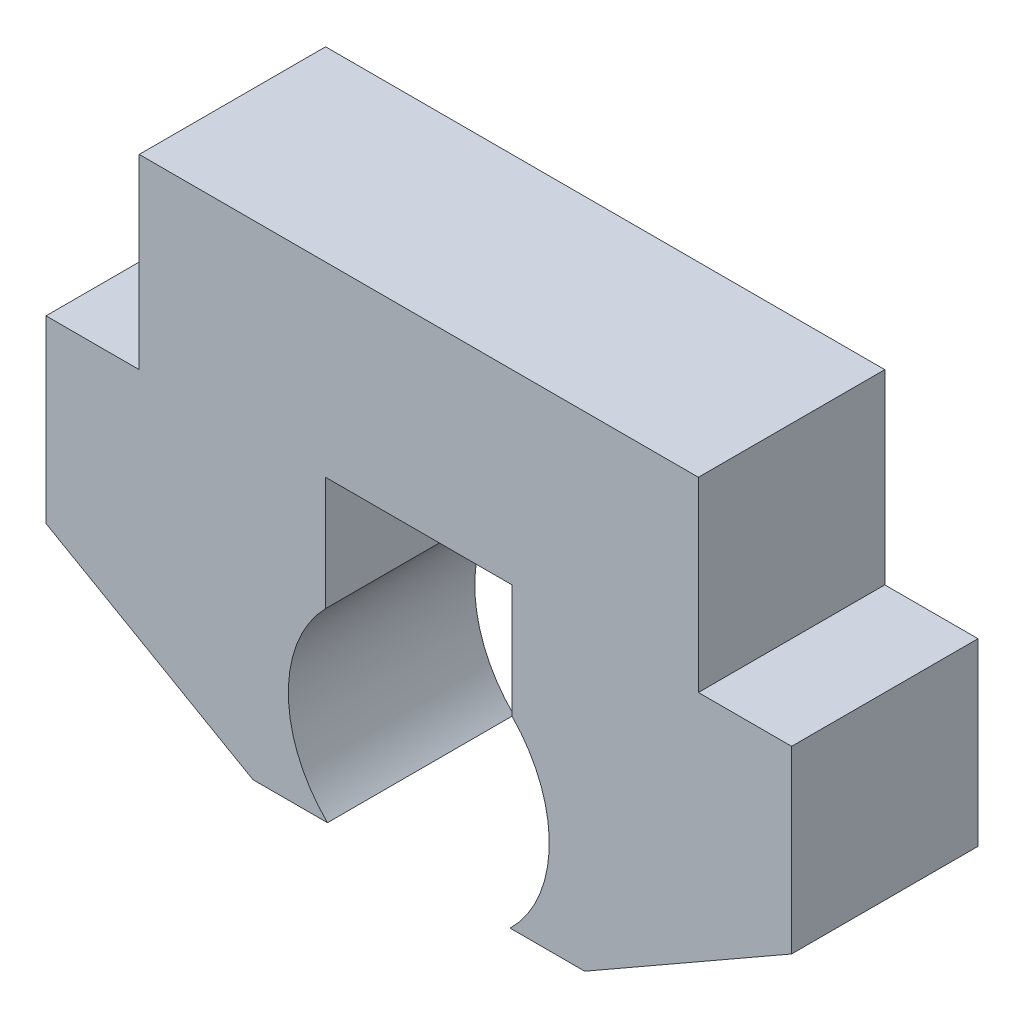
ISO-10303-21;
HEADER;
FILE_DESCRIPTION(('STEP AP214'),'2;1');
FILE_NAME('part.step','',(''),(''),'','','');
FILE_SCHEMA(('AUTOMOTIVE_DESIGN { 1 0 10303 214 1 1 1 1 }'));
ENDSEC;
DATA;
#1=APPLICATION_CONTEXT('core data for automotive mechanical design processes');
#2=APPLICATION_PROTOCOL_DEFINITION('international standard','automotive_design',2000,#1);
#3=PRODUCT_CONTEXT('',#1,'mechanical');
#4=PRODUCT('Part','Part','',(#3));
#5=PRODUCT_RELATED_PRODUCT_CATEGORY('part','',(#4));
#6=PRODUCT_DEFINITION_FORMATION('','',#4);
#7=PRODUCT_DEFINITION_CONTEXT('part definition',#1,'design');
#8=PRODUCT_DEFINITION('design','',#6,#7);
#9=PRODUCT_DEFINITION_SHAPE('','',#8);
#10=(LENGTH_UNIT() NAMED_UNIT(*) SI_UNIT(.MILLI.,.METRE.));
#11=(NAMED_UNIT(*) PLANE_ANGLE_UNIT() SI_UNIT($,.RADIAN.));
#12=(NAMED_UNIT(*) SI_UNIT($,.STERADIAN.) SOLID_ANGLE_UNIT());
#13=UNCERTAINTY_MEASURE_WITH_UNIT(LENGTH_MEASURE(1.E-05),#10,'distance_accuracy_value','');
#14=(GEOMETRIC_REPRESENTATION_CONTEXT(3) GLOBAL_UNCERTAINTY_ASSIGNED_CONTEXT((#13)) GLOBAL_UNIT_ASSIGNED_CONTEXT((#10,
#11,#12)) REPRESENTATION_CONTEXT('',''));
#15=CARTESIAN_POINT('',(0.,0.,0.));
#16=DIRECTION('',(0.,0.,1.));
#17=DIRECTION('',(1.,0.,0.));
#18=AXIS2_PLACEMENT_3D('',#15,#16,#17);
#19=CARTESIAN_POINT('',(12.5,8.82463386228836,5.));
#20=DIRECTION('',(1.,0.,0.));
#21=DIRECTION('',(0.,0.,-1.));
#22=AXIS2_PLACEMENT_3D('',#19,#20,#21);
#23=PLANE('',#22);
#24=DIRECTION('',(0.,-1.,0.));
#25=VECTOR('',#24,1.);
#26=CARTESIAN_POINT('',(12.5,8.82463386228836,0.));
#27=LINE('',#26,#25);
#28=CARTESIAN_POINT('',(12.5,8.82463386228836,0.));
#29=VERTEX_POINT('',#28);
#30=CARTESIAN_POINT('',(12.5,5.77412360507153,0.));
#31=VERTEX_POINT('',#30);
#32=EDGE_CURVE('E303',#29,#31,#27,.T.);
#33=ORIENTED_EDGE('',*,*,#32,.T.);
#34=DIRECTION('',(0.,0.,-1.));
#35=VECTOR('',#34,1.);
#36=CARTESIAN_POINT('',(12.5,5.77412360507153,5.));
#37=LINE('',#36,#35);
#38=CARTESIAN_POINT('',(12.5,5.77412360507153,5.));
#39=VERTEX_POINT('',#38);
#40=EDGE_CURVE('E12',#39,#31,#37,.T.);
#41=ORIENTED_EDGE('',*,*,#40,.F.);
#42=DIRECTION('',(0.,-1.,0.));
#43=VECTOR('',#42,1.);
#44=CARTESIAN_POINT('',(12.5,8.82463386228836,5.));
#45=LINE('',#44,#43);
#46=CARTESIAN_POINT('',(12.5,8.82463386228836,5.));
#47=VERTEX_POINT('',#46);
#48=EDGE_CURVE('E244',#47,#39,#45,.T.);
#49=ORIENTED_EDGE('',*,*,#48,.F.);
#50=DIRECTION('',(0.,0.,-1.));
#51=VECTOR('',#50,1.);
#52=CARTESIAN_POINT('',(12.5,8.82463386228836,5.));
#53=LINE('',#52,#51);
#54=EDGE_CURVE('E181',#47,#29,#53,.T.);
#55=ORIENTED_EDGE('',*,*,#54,.T.);
#56=EDGE_LOOP('',(#33,#41,#49,#55));
#57=FACE_BOUND('',#56,.T.);
#58=ADVANCED_FACE('F38',(#57),#23,.F.);
#59=CARTESIAN_POINT('',(10.,3.32463386228836,5.));
#60=DIRECTION('',(0.,0.,-1.));
#61=DIRECTION('',(-1.,0.,0.));
#62=AXIS2_PLACEMENT_3D('',#59,#60,#61);
#63=CYLINDRICAL_SURFACE('',#62,3.5);
#64=CARTESIAN_POINT('',(10.,3.32463386228836,0.));
#65=DIRECTION('',(0.,0.,-1.));
#66=DIRECTION('',(1.,0.,0.));
#67=AXIS2_PLACEMENT_3D('',#64,#65,#66);
#68=CIRCLE('',#67,3.5);
#69=CARTESIAN_POINT('',(12.4494897427832,0.824633862288362,0.));
#70=VERTEX_POINT('',#69);
#71=EDGE_CURVE('E297',#31,#70,#68,.T.);
#72=ORIENTED_EDGE('',*,*,#71,.T.);
#73=DIRECTION('',(0.,0.,-1.));
#74=VECTOR('',#73,1.);
#75=CARTESIAN_POINT('',(12.4494897427832,0.824633862288362,5.));
#76=LINE('',#75,#74);
#77=CARTESIAN_POINT('',(12.4494897427832,0.824633862288362,5.));
#78=VERTEX_POINT('',#77);
#79=EDGE_CURVE('E46',#78,#70,#76,.T.);
#80=ORIENTED_EDGE('',*,*,#79,.F.);
#81=CARTESIAN_POINT('',(10.,3.32463386228836,5.));
#82=DIRECTION('',(0.,0.,-1.));
#83=DIRECTION('',(1.,0.,0.));
#84=AXIS2_PLACEMENT_3D('',#81,#82,#83);
#85=CIRCLE('',#84,3.5);
#86=EDGE_CURVE('E121',#39,#78,#85,.T.);
#87=ORIENTED_EDGE('',*,*,#86,.F.);
#88=ORIENTED_EDGE('',*,*,#40,.T.);
#89=EDGE_LOOP('',(#72,#80,#87,#88));
#90=FACE_BOUND('',#89,.T.);
#91=ADVANCED_FACE('F341',(#90),#63,.F.);
#92=CARTESIAN_POINT('',(12.4494897427832,0.824633862288362,5.));
#93=DIRECTION('',(0.,1.,0.));
#94=DIRECTION('',(0.,0.,1.));
#95=AXIS2_PLACEMENT_3D('',#92,#93,#94);
#96=PLANE('',#95);
#97=DIRECTION('',(1.,0.,0.));
#98=VECTOR('',#97,1.);
#99=CARTESIAN_POINT('',(12.4494897427832,0.824633862288362,0.));
#100=LINE('',#99,#98);
#101=CARTESIAN_POINT('',(14.4494897427832,0.824633862288362,0.));
#102=VERTEX_POINT('',#101);
#103=EDGE_CURVE('E292',#70,#102,#100,.T.);
#104=ORIENTED_EDGE('',*,*,#103,.T.);
#105=DIRECTION('',(0.,0.,-1.));
#106=VECTOR('',#105,1.);
#107=CARTESIAN_POINT('',(14.4494897427832,0.824633862288362,5.));
#108=LINE('',#107,#106);
#109=CARTESIAN_POINT('',(14.4494897427832,0.824633862288362,5.));
#110=VERTEX_POINT('',#109);
#111=EDGE_CURVE('E284',#110,#102,#108,.T.);
#112=ORIENTED_EDGE('',*,*,#111,.F.);
#113=DIRECTION('',(1.,0.,0.));
#114=VECTOR('',#113,1.);
#115=CARTESIAN_POINT('',(12.4494897427832,0.824633862288362,5.));
#116=LINE('',#115,#114);
#117=EDGE_CURVE('E236',#78,#110,#116,.T.);
#118=ORIENTED_EDGE('',*,*,#117,.F.);
#119=ORIENTED_EDGE('',*,*,#79,.T.);
#120=EDGE_LOOP('',(#104,#112,#118,#119));
#121=FACE_BOUND('',#120,.T.);
#122=ADVANCED_FACE('F290',(#121),#96,.F.);
#123=CARTESIAN_POINT('',(20.,4.,5.));
#124=DIRECTION('',(-0.496568694783565,0.867997425895346,0.));
#125=DIRECTION('',(-0.867997425895346,-0.496568694783565,0.));
#126=AXIS2_PLACEMENT_3D('',#123,#124,#125);
#127=PLANE('',#126);
#128=DIRECTION('',(0.867997425895346,0.496568694783565,0.));
#129=VECTOR('',#128,1.);
#130=CARTESIAN_POINT('',(20.,4.,0.));
#131=LINE('',#130,#129);
#132=CARTESIAN_POINT('',(20.,4.,0.));
#133=VERTEX_POINT('',#132);
#134=EDGE_CURVE('E299',#102,#133,#131,.T.);
#135=ORIENTED_EDGE('',*,*,#134,.T.);
#136=DIRECTION('',(0.,0.,-1.));
#137=VECTOR('',#136,1.);
#138=CARTESIAN_POINT('',(20.,4.,5.));
#139=LINE('',#138,#137);
#140=CARTESIAN_POINT('',(20.,4.,5.));
#141=VERTEX_POINT('',#140);
#142=EDGE_CURVE('E281',#141,#133,#139,.T.);
#143=ORIENTED_EDGE('',*,*,#142,.F.);
#144=DIRECTION('',(0.867997425895346,0.496568694783565,0.));
#145=VECTOR('',#144,1.);
#146=CARTESIAN_POINT('',(20.,4.,5.));
#147=LINE('',#146,#145);
#148=EDGE_CURVE('E232',#110,#141,#147,.T.);
#149=ORIENTED_EDGE('',*,*,#148,.F.);
#150=ORIENTED_EDGE('',*,*,#111,.T.);
#151=EDGE_LOOP('',(#135,#143,#149,#150));
#152=FACE_BOUND('',#151,.T.);
#153=ADVANCED_FACE('F348',(#152),#127,.F.);
#154=CARTESIAN_POINT('',(20.,4.,5.));
#155=DIRECTION('',(-1.,0.,0.));
#156=DIRECTION('',(0.,0.,1.));
#157=AXIS2_PLACEMENT_3D('',#154,#155,#156);
#158=PLANE('',#157);
#159=DIRECTION('',(0.,1.,0.));
#160=VECTOR('',#159,1.);
#161=CARTESIAN_POINT('',(20.,4.,0.));
#162=LINE('',#161,#160);
#163=CARTESIAN_POINT('',(20.,8.82463386228836,0.));
#164=VERTEX_POINT('',#163);
#165=EDGE_CURVE('E301',#133,#164,#162,.T.);
#166=ORIENTED_EDGE('',*,*,#165,.T.);
#167=DIRECTION('',(0.,0.,-1.));
#168=VECTOR('',#167,1.);
#169=CARTESIAN_POINT('',(20.,8.82463386228836,5.));
#170=LINE('',#169,#168);
#171=CARTESIAN_POINT('',(20.,8.82463386228836,5.));
#172=VERTEX_POINT('',#171);
#173=EDGE_CURVE('E278',#172,#164,#170,.T.);
#174=ORIENTED_EDGE('',*,*,#173,.F.);
#175=DIRECTION('',(0.,1.,0.));
#176=VECTOR('',#175,1.);
#177=CARTESIAN_POINT('',(20.,4.,5.));
#178=LINE('',#177,#176);
#179=EDGE_CURVE('E229',#141,#172,#178,.T.);
#180=ORIENTED_EDGE('',*,*,#179,.F.);
#181=ORIENTED_EDGE('',*,*,#142,.T.);
#182=EDGE_LOOP('',(#166,#174,#180,#181));
#183=FACE_BOUND('',#182,.T.);
#184=ADVANCED_FACE('F353',(#183),#158,.F.);
#185=CARTESIAN_POINT('',(17.5,8.82463386228836,5.));
#186=DIRECTION('',(0.,-1.,0.));
#187=DIRECTION('',(0.,0.,-1.));
#188=AXIS2_PLACEMENT_3D('',#185,#186,#187);
#189=PLANE('',#188);
#190=DIRECTION('',(-1.,0.,0.));
#191=VECTOR('',#190,1.);
#192=CARTESIAN_POINT('',(17.5,8.82463386228836,0.));
#193=LINE('',#192,#191);
#194=CARTESIAN_POINT('',(17.5,8.82463386228836,0.));
#195=VERTEX_POINT('',#194);
#196=EDGE_CURVE('E307',#164,#195,#193,.T.);
#197=ORIENTED_EDGE('',*,*,#196,.T.);
#198=DIRECTION('',(0.,0.,-1.));
#199=VECTOR('',#198,1.);
#200=CARTESIAN_POINT('',(17.5,8.82463386228836,5.));
#201=LINE('',#200,#199);
#202=CARTESIAN_POINT('',(17.5,8.82463386228836,5.));
#203=VERTEX_POINT('',#202);
#204=EDGE_CURVE('E275',#203,#195,#201,.T.);
#205=ORIENTED_EDGE('',*,*,#204,.F.);
#206=DIRECTION('',(-1.,0.,0.));
#207=VECTOR('',#206,1.);
#208=CARTESIAN_POINT('',(17.5,8.82463386228836,5.));
#209=LINE('',#208,#207);
#210=EDGE_CURVE('E221',#172,#203,#209,.T.);
#211=ORIENTED_EDGE('',*,*,#210,.F.);
#212=ORIENTED_EDGE('',*,*,#173,.T.);
#213=EDGE_LOOP('',(#197,#205,#211,#212));
#214=FACE_BOUND('',#213,.T.);
#215=ADVANCED_FACE('F357',(#214),#189,.F.);
#216=CARTESIAN_POINT('',(17.5,8.82463386228836,5.));
#217=DIRECTION('',(-1.,0.,0.));
#218=DIRECTION('',(0.,0.,1.));
#219=AXIS2_PLACEMENT_3D('',#216,#217,#218);
#220=PLANE('',#219);
#221=DIRECTION('',(0.,1.,0.));
#222=VECTOR('',#221,1.);
#223=CARTESIAN_POINT('',(17.5,8.82463386228836,0.));
#224=LINE('',#223,#222);
#225=CARTESIAN_POINT('',(17.5,13.8246338622884,0.));
#226=VERTEX_POINT('',#225);
#227=EDGE_CURVE('E309',#195,#226,#224,.T.);
#228=ORIENTED_EDGE('',*,*,#227,.T.);
#229=DIRECTION('',(0.,0.,-1.));
#230=VECTOR('',#229,1.);
#231=CARTESIAN_POINT('',(17.5,13.8246338622884,5.));
#232=LINE('',#231,#230);
#233=CARTESIAN_POINT('',(17.5,13.8246338622884,5.));
#234=VERTEX_POINT('',#233);
#235=EDGE_CURVE('E272',#234,#226,#232,.T.);
#236=ORIENTED_EDGE('',*,*,#235,.F.);
#237=DIRECTION('',(0.,1.,0.));
#238=VECTOR('',#237,1.);
#239=CARTESIAN_POINT('',(17.5,8.82463386228836,5.));
#240=LINE('',#239,#238);
#241=EDGE_CURVE('E217',#203,#234,#240,.T.);
#242=ORIENTED_EDGE('',*,*,#241,.F.);
#243=ORIENTED_EDGE('',*,*,#204,.T.);
#244=EDGE_LOOP('',(#228,#236,#242,#243));
#245=FACE_BOUND('',#244,.T.);
#246=ADVANCED_FACE('F361',(#245),#220,.F.);
#247=CARTESIAN_POINT('',(2.5,13.8246338622884,5.));
#248=DIRECTION('',(0.,-1.,0.));
#249=DIRECTION('',(0.,0.,-1.));
#250=AXIS2_PLACEMENT_3D('',#247,#248,#249);
#251=PLANE('',#250);
#252=DIRECTION('',(-1.,0.,0.));
#253=VECTOR('',#252,1.);
#254=CARTESIAN_POINT('',(2.5,13.8246338622884,0.));
#255=LINE('',#254,#253);
#256=CARTESIAN_POINT('',(2.5,13.8246338622884,0.));
#257=VERTEX_POINT('',#256);
#258=EDGE_CURVE('E312',#226,#257,#255,.T.);
#259=ORIENTED_EDGE('',*,*,#258,.T.);
#260=DIRECTION('',(0.,0.,-1.));
#261=VECTOR('',#260,1.);
#262=CARTESIAN_POINT('',(2.5,13.8246338622884,5.));
#263=LINE('',#262,#261);
#264=CARTESIAN_POINT('',(2.5,13.8246338622884,5.));
#265=VERTEX_POINT('',#264);
#266=EDGE_CURVE('E269',#265,#257,#263,.T.);
#267=ORIENTED_EDGE('',*,*,#266,.F.);
#268=DIRECTION('',(-1.,0.,0.));
#269=VECTOR('',#268,1.);
#270=CARTESIAN_POINT('',(10.,13.8246338622884,5.));
#271=LINE('',#270,#269);
#272=EDGE_CURVE('E213',#234,#265,#271,.T.);
#273=ORIENTED_EDGE('',*,*,#272,.F.);
#274=ORIENTED_EDGE('',*,*,#235,.T.);
#275=EDGE_LOOP('',(#259,#267,#273,#274));
#276=FACE_BOUND('',#275,.T.);
#277=ADVANCED_FACE('F365',(#276),#251,.F.);
#278=CARTESIAN_POINT('',(2.5,8.82463386228836,5.));
#279=DIRECTION('',(1.,0.,0.));
#280=DIRECTION('',(0.,0.,-1.));
#281=AXIS2_PLACEMENT_3D('',#278,#279,#280);
#282=PLANE('',#281);
#283=DIRECTION('',(0.,-1.,0.));
#284=VECTOR('',#283,1.);
#285=CARTESIAN_POINT('',(2.5,8.82463386228836,0.));
#286=LINE('',#285,#284);
#287=CARTESIAN_POINT('',(2.5,8.82463386228836,0.));
#288=VERTEX_POINT('',#287);
#289=EDGE_CURVE('E314',#257,#288,#286,.T.);
#290=ORIENTED_EDGE('',*,*,#289,.T.);
#291=DIRECTION('',(0.,0.,-1.));
#292=VECTOR('',#291,1.);
#293=CARTESIAN_POINT('',(2.5,8.82463386228836,5.));
#294=LINE('',#293,#292);
#295=CARTESIAN_POINT('',(2.5,8.82463386228836,5.));
#296=VERTEX_POINT('',#295);
#297=EDGE_CURVE('E266',#296,#288,#294,.T.);
#298=ORIENTED_EDGE('',*,*,#297,.F.);
#299=DIRECTION('',(0.,-1.,0.));
#300=VECTOR('',#299,1.);
#301=CARTESIAN_POINT('',(2.5,8.82463386228836,5.));
#302=LINE('',#301,#300);
#303=EDGE_CURVE('E210',#265,#296,#302,.T.);
#304=ORIENTED_EDGE('',*,*,#303,.F.);
#305=ORIENTED_EDGE('',*,*,#266,.T.);
#306=EDGE_LOOP('',(#290,#298,#304,#305));
#307=FACE_BOUND('',#306,.T.);
#308=ADVANCED_FACE('F369',(#307),#282,.F.);
#309=CARTESIAN_POINT('',(2.5,8.82463386228836,5.));
#310=DIRECTION('',(0.,-1.,0.));
#311=DIRECTION('',(0.,0.,-1.));
#312=AXIS2_PLACEMENT_3D('',#309,#310,#311);
#313=PLANE('',#312);
#314=DIRECTION('',(-1.,0.,0.));
#315=VECTOR('',#314,1.);
#316=CARTESIAN_POINT('',(2.5,8.82463386228836,0.));
#317=LINE('',#316,#315);
#318=CARTESIAN_POINT('',(0.,8.82463386228836,0.));
#319=VERTEX_POINT('',#318);
#320=EDGE_CURVE('E316',#288,#319,#317,.T.);
#321=ORIENTED_EDGE('',*,*,#320,.T.);
#322=DIRECTION('',(0.,0.,-1.));
#323=VECTOR('',#322,1.);
#324=CARTESIAN_POINT('',(0.,8.82463386228836,5.));
#325=LINE('',#324,#323);
#326=CARTESIAN_POINT('',(0.,8.82463386228836,5.));
#327=VERTEX_POINT('',#326);
#328=EDGE_CURVE('E263',#327,#319,#325,.T.);
#329=ORIENTED_EDGE('',*,*,#328,.F.);
#330=DIRECTION('',(-1.,0.,0.));
#331=VECTOR('',#330,1.);
#332=CARTESIAN_POINT('',(2.5,8.82463386228836,5.));
#333=LINE('',#332,#331);
#334=EDGE_CURVE('E202',#296,#327,#333,.T.);
#335=ORIENTED_EDGE('',*,*,#334,.F.);
#336=ORIENTED_EDGE('',*,*,#297,.T.);
#337=EDGE_LOOP('',(#321,#329,#335,#336));
#338=FACE_BOUND('',#337,.T.);
#339=ADVANCED_FACE('F373',(#338),#313,.F.);
#340=CARTESIAN_POINT('',(0.,4.,5.));
#341=DIRECTION('',(1.,0.,0.));
#342=DIRECTION('',(0.,0.,-1.));
#343=AXIS2_PLACEMENT_3D('',#340,#341,#342);
#344=PLANE('',#343);
#345=DIRECTION('',(0.,-1.,0.));
#346=VECTOR('',#345,1.);
#347=CARTESIAN_POINT('',(0.,4.,0.));
#348=LINE('',#347,#346);
#349=CARTESIAN_POINT('',(0.,4.,0.));
#350=VERTEX_POINT('',#349);
#351=EDGE_CURVE('E318',#319,#350,#348,.T.);
#352=ORIENTED_EDGE('',*,*,#351,.T.);
#353=DIRECTION('',(0.,0.,-1.));
#354=VECTOR('',#353,1.);
#355=CARTESIAN_POINT('',(0.,4.,5.));
#356=LINE('',#355,#354);
#357=CARTESIAN_POINT('',(0.,4.,5.));
#358=VERTEX_POINT('',#357);
#359=EDGE_CURVE('E260',#358,#350,#356,.T.);
#360=ORIENTED_EDGE('',*,*,#359,.F.);
#361=DIRECTION('',(0.,-1.,0.));
#362=VECTOR('',#361,1.);
#363=CARTESIAN_POINT('',(0.,4.,5.));
#364=LINE('',#363,#362);
#365=EDGE_CURVE('E198',#327,#358,#364,.T.);
#366=ORIENTED_EDGE('',*,*,#365,.F.);
#367=ORIENTED_EDGE('',*,*,#328,.T.);
#368=EDGE_LOOP('',(#352,#360,#366,#367));
#369=FACE_BOUND('',#368,.T.);
#370=ADVANCED_FACE('F377',(#369),#344,.F.);
#371=CARTESIAN_POINT('',(0.,4.,5.));
#372=DIRECTION('',(0.496568694783565,0.867997425895346,0.));
#373=DIRECTION('',(-0.867997425895346,0.496568694783565,0.));
#374=AXIS2_PLACEMENT_3D('',#371,#372,#373);
#375=PLANE('',#374);
#376=DIRECTION('',(0.867997425895346,-0.496568694783565,0.));
#377=VECTOR('',#376,1.);
#378=CARTESIAN_POINT('',(0.,4.,0.));
#379=LINE('',#378,#377);
#380=CARTESIAN_POINT('',(5.55051025721682,0.824633862288362,0.));
#381=VERTEX_POINT('',#380);
#382=EDGE_CURVE('E320',#350,#381,#379,.T.);
#383=ORIENTED_EDGE('',*,*,#382,.T.);
#384=DIRECTION('',(0.,0.,-1.));
#385=VECTOR('',#384,1.);
#386=CARTESIAN_POINT('',(5.55051025721682,0.824633862288362,5.));
#387=LINE('',#386,#385);
#388=CARTESIAN_POINT('',(5.55051025721682,0.824633862288362,5.));
#389=VERTEX_POINT('',#388);
#390=EDGE_CURVE('E257',#389,#381,#387,.T.);
#391=ORIENTED_EDGE('',*,*,#390,.F.);
#392=DIRECTION('',(0.867997425895346,-0.496568694783565,0.));
#393=VECTOR('',#392,1.);
#394=CARTESIAN_POINT('',(0.,4.,5.));
#395=LINE('',#394,#393);
#396=EDGE_CURVE('E194',#358,#389,#395,.T.);
#397=ORIENTED_EDGE('',*,*,#396,.F.);
#398=ORIENTED_EDGE('',*,*,#359,.T.);
#399=EDGE_LOOP('',(#383,#391,#397,#398));
#400=FACE_BOUND('',#399,.T.);
#401=ADVANCED_FACE('F381',(#400),#375,.F.);
#402=CARTESIAN_POINT('',(5.55051025721682,0.824633862288362,5.));
#403=DIRECTION('',(0.,1.,0.));
#404=DIRECTION('',(0.,0.,1.));
#405=AXIS2_PLACEMENT_3D('',#402,#403,#404);
#406=PLANE('',#405);
#407=DIRECTION('',(1.,0.,0.));
#408=VECTOR('',#407,1.);
#409=CARTESIAN_POINT('',(5.55051025721682,0.824633862288362,0.));
#410=LINE('',#409,#408);
#411=CARTESIAN_POINT('',(7.55051025721682,0.824633862288362,0.));
#412=VERTEX_POINT('',#411);
#413=EDGE_CURVE('E322',#381,#412,#410,.T.);
#414=ORIENTED_EDGE('',*,*,#413,.T.);
#415=DIRECTION('',(0.,0.,-1.));
#416=VECTOR('',#415,1.);
#417=CARTESIAN_POINT('',(7.55051025721682,0.824633862288362,5.));
#418=LINE('',#417,#416);
#419=CARTESIAN_POINT('',(7.55051025721682,0.824633862288362,5.));
#420=VERTEX_POINT('',#419);
#421=EDGE_CURVE('E174',#420,#412,#418,.T.);
#422=ORIENTED_EDGE('',*,*,#421,.F.);
#423=DIRECTION('',(1.,0.,0.));
#424=VECTOR('',#423,1.);
#425=CARTESIAN_POINT('',(5.55051025721682,0.824633862288362,5.));
#426=LINE('',#425,#424);
#427=EDGE_CURVE('E164',#389,#420,#426,.T.);
#428=ORIENTED_EDGE('',*,*,#427,.F.);
#429=ORIENTED_EDGE('',*,*,#390,.T.);
#430=EDGE_LOOP('',(#414,#422,#428,#429));
#431=FACE_BOUND('',#430,.T.);
#432=ADVANCED_FACE('F325',(#431),#406,.F.);
#433=CARTESIAN_POINT('',(10.,3.32463386228836,5.));
#434=DIRECTION('',(0.,0.,-1.));
#435=DIRECTION('',(-1.,0.,0.));
#436=AXIS2_PLACEMENT_3D('',#433,#434,#435);
#437=CYLINDRICAL_SURFACE('',#436,3.5);
#438=CARTESIAN_POINT('',(10.,3.32463386228836,0.));
#439=DIRECTION('',(0.,0.,-1.));
#440=DIRECTION('',(1.,0.,0.));
#441=AXIS2_PLACEMENT_3D('',#438,#439,#440);
#442=CIRCLE('',#441,3.5);
#443=CARTESIAN_POINT('',(7.50000000000001,5.77412360507155,0.));
#444=VERTEX_POINT('',#443);
#445=EDGE_CURVE('E173',#412,#444,#442,.T.);
#446=ORIENTED_EDGE('',*,*,#445,.T.);
#447=DIRECTION('',(0.,0.,-1.));
#448=VECTOR('',#447,1.);
#449=CARTESIAN_POINT('',(7.50000000000001,5.77412360507155,5.));
#450=LINE('',#449,#448);
#451=CARTESIAN_POINT('',(7.50000000000001,5.77412360507155,5.));
#452=VERTEX_POINT('',#451);
#453=EDGE_CURVE('E170',#452,#444,#450,.T.);
#454=ORIENTED_EDGE('',*,*,#453,.F.);
#455=CARTESIAN_POINT('',(10.,3.32463386228836,5.));
#456=DIRECTION('',(0.,0.,-1.));
#457=DIRECTION('',(1.,0.,0.));
#458=AXIS2_PLACEMENT_3D('',#455,#456,#457);
#459=CIRCLE('',#458,3.5);
#460=EDGE_CURVE('E158',#420,#452,#459,.T.);
#461=ORIENTED_EDGE('',*,*,#460,.F.);
#462=ORIENTED_EDGE('',*,*,#421,.T.);
#463=EDGE_LOOP('',(#446,#454,#461,#462));
#464=FACE_BOUND('',#463,.T.);
#465=ADVANCED_FACE('F171',(#464),#437,.F.);
#466=CARTESIAN_POINT('',(7.50000000000001,8.82463386228836,5.));
#467=DIRECTION('',(-1.,0.,0.));
#468=DIRECTION('',(0.,0.,1.));
#469=AXIS2_PLACEMENT_3D('',#466,#467,#468);
#470=PLANE('',#469);
#471=DIRECTION('',(0.,1.,0.));
#472=VECTOR('',#471,1.);
#473=CARTESIAN_POINT('',(7.50000000000001,8.82463386228836,0.));
#474=LINE('',#473,#472);
#475=CARTESIAN_POINT('',(7.50000000000001,8.82463386228836,0.));
#476=VERTEX_POINT('',#475);
#477=EDGE_CURVE('E107',#444,#476,#474,.T.);
#478=ORIENTED_EDGE('',*,*,#477,.T.);
#479=DIRECTION('',(0.,0.,-1.));
#480=VECTOR('',#479,1.);
#481=CARTESIAN_POINT('',(7.50000000000001,8.82463386228836,5.));
#482=LINE('',#481,#480);
#483=CARTESIAN_POINT('',(7.50000000000001,8.82463386228836,5.));
#484=VERTEX_POINT('',#483);
#485=EDGE_CURVE('E175',#484,#476,#482,.T.);
#486=ORIENTED_EDGE('',*,*,#485,.F.);
#487=DIRECTION('',(0.,1.,0.));
#488=VECTOR('',#487,1.);
#489=CARTESIAN_POINT('',(7.50000000000001,8.82463386228836,5.));
#490=LINE('',#489,#488);
#491=EDGE_CURVE('E162',#452,#484,#490,.T.);
#492=ORIENTED_EDGE('',*,*,#491,.F.);
#493=ORIENTED_EDGE('',*,*,#453,.T.);
#494=EDGE_LOOP('',(#478,#486,#492,#493));
#495=FACE_BOUND('',#494,.T.);
#496=ADVANCED_FACE('F177',(#495),#470,.F.);
#497=CARTESIAN_POINT('',(7.50000000000001,8.82463386228836,5.));
#498=DIRECTION('',(0.,1.,0.));
#499=DIRECTION('',(-1.,0.,0.));
#500=AXIS2_PLACEMENT_3D('',#497,#498,#499);
#501=PLANE('',#500);
#502=DIRECTION('',(1.,0.,0.));
#503=VECTOR('',#502,1.);
#504=CARTESIAN_POINT('',(7.50000000000001,8.82463386228836,0.));
#505=LINE('',#504,#503);
#506=EDGE_CURVE('E113',#476,#29,#505,.T.);
#507=ORIENTED_EDGE('',*,*,#506,.T.);
#508=ORIENTED_EDGE('',*,*,#54,.F.);
#509=DIRECTION('',(1.,0.,0.));
#510=VECTOR('',#509,1.);
#511=CARTESIAN_POINT('',(7.50000000000001,8.82463386228836,5.));
#512=LINE('',#511,#510);
#513=EDGE_CURVE('E54',#484,#47,#512,.T.);
#514=ORIENTED_EDGE('',*,*,#513,.F.);
#515=ORIENTED_EDGE('',*,*,#485,.T.);
#516=EDGE_LOOP('',(#507,#508,#514,#515));
#517=FACE_BOUND('',#516,.T.);
#518=ADVANCED_FACE('F330',(#517),#501,.F.);
#519=CARTESIAN_POINT('',(10.,3.32463386228836,5.));
#520=DIRECTION('',(0.,0.,1.));
#521=DIRECTION('',(1.,0.,0.));
#522=AXIS2_PLACEMENT_3D('',#519,#520,#521);
#523=PLANE('',#522);
#524=ORIENTED_EDGE('',*,*,#48,.T.);
#525=ORIENTED_EDGE('',*,*,#86,.T.);
#526=ORIENTED_EDGE('',*,*,#117,.T.);
#527=ORIENTED_EDGE('',*,*,#148,.T.);
#528=ORIENTED_EDGE('',*,*,#179,.T.);
#529=ORIENTED_EDGE('',*,*,#210,.T.);
#530=ORIENTED_EDGE('',*,*,#241,.T.);
#531=ORIENTED_EDGE('',*,*,#272,.T.);
#532=ORIENTED_EDGE('',*,*,#303,.T.);
#533=ORIENTED_EDGE('',*,*,#334,.T.);
#534=ORIENTED_EDGE('',*,*,#365,.T.);
#535=ORIENTED_EDGE('',*,*,#396,.T.);
#536=ORIENTED_EDGE('',*,*,#427,.T.);
#537=ORIENTED_EDGE('',*,*,#460,.T.);
#538=ORIENTED_EDGE('',*,*,#491,.T.);
#539=ORIENTED_EDGE('',*,*,#513,.T.);
#540=EDGE_LOOP('',(#524,#525,#526,#527,#528,#529,#530,#531,#532,#533,#534,#535,#536,#537,#538,#539));
#541=FACE_BOUND('',#540,.T.);
#542=ADVANCED_FACE('F160',(#541),#523,.T.);
#543=CARTESIAN_POINT('',(10.,3.32463386228836,0.));
#544=DIRECTION('',(0.,0.,1.));
#545=DIRECTION('',(1.,0.,0.));
#546=AXIS2_PLACEMENT_3D('',#543,#544,#545);
#547=PLANE('',#546);
#548=ORIENTED_EDGE('',*,*,#32,.F.);
#549=ORIENTED_EDGE('',*,*,#506,.F.);
#550=ORIENTED_EDGE('',*,*,#477,.F.);
#551=ORIENTED_EDGE('',*,*,#445,.F.);
#552=ORIENTED_EDGE('',*,*,#413,.F.);
#553=ORIENTED_EDGE('',*,*,#382,.F.);
#554=ORIENTED_EDGE('',*,*,#351,.F.);
#555=ORIENTED_EDGE('',*,*,#320,.F.);
#556=ORIENTED_EDGE('',*,*,#289,.F.);
#557=ORIENTED_EDGE('',*,*,#258,.F.);
#558=ORIENTED_EDGE('',*,*,#227,.F.);
#559=ORIENTED_EDGE('',*,*,#196,.F.);
#560=ORIENTED_EDGE('',*,*,#165,.F.);
#561=ORIENTED_EDGE('',*,*,#134,.F.);
#562=ORIENTED_EDGE('',*,*,#103,.F.);
#563=ORIENTED_EDGE('',*,*,#71,.F.);
#564=EDGE_LOOP('',(#548,#549,#550,#551,#552,#553,#554,#555,#556,#557,#558,#559,#560,#561,#562,#563));
#565=FACE_BOUND('',#564,.T.);
#566=ADVANCED_FACE('F296',(#565),#547,.F.);
#567=CLOSED_SHELL('',(#58,#91,#122,#153,#184,#215,#246,#277,#308,#339,#370,#401,#432,#465,#496,
#518,#542,#566));
#568=MANIFOLD_SOLID_BREP('B2',#567);
#569=ADVANCED_BREP_SHAPE_REPRESENTATION('',(#18,#568),#14);
#570=SHAPE_DEFINITION_REPRESENTATION(#9,#569);
ENDSEC;
END-ISO-10303-21;
